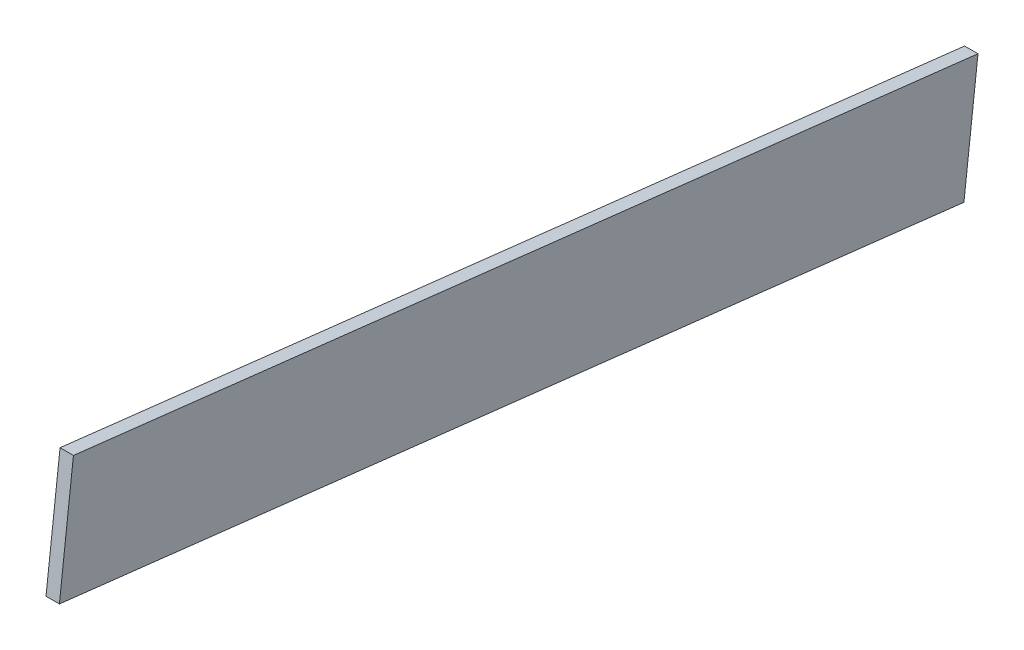
ISO-10303-21;
HEADER;
FILE_DESCRIPTION(('STEP AP214'),'2;1');
FILE_NAME('part.step','',(''),(''),'','','');
FILE_SCHEMA(('AUTOMOTIVE_DESIGN { 1 0 10303 214 1 1 1 1 }'));
ENDSEC;
DATA;
#1=APPLICATION_CONTEXT('core data for automotive mechanical design processes');
#2=APPLICATION_PROTOCOL_DEFINITION('international standard','automotive_design',2000,#1);
#3=PRODUCT_CONTEXT('',#1,'mechanical');
#4=PRODUCT('Part','Part','',(#3));
#5=PRODUCT_RELATED_PRODUCT_CATEGORY('part','',(#4));
#6=PRODUCT_DEFINITION_FORMATION('','',#4);
#7=PRODUCT_DEFINITION_CONTEXT('part definition',#1,'design');
#8=PRODUCT_DEFINITION('design','',#6,#7);
#9=PRODUCT_DEFINITION_SHAPE('','',#8);
#10=(LENGTH_UNIT() NAMED_UNIT(*) SI_UNIT(.MILLI.,.METRE.));
#11=(NAMED_UNIT(*) PLANE_ANGLE_UNIT() SI_UNIT($,.RADIAN.));
#12=(NAMED_UNIT(*) SI_UNIT($,.STERADIAN.) SOLID_ANGLE_UNIT());
#13=UNCERTAINTY_MEASURE_WITH_UNIT(LENGTH_MEASURE(1.E-05),#10,'distance_accuracy_value','');
#14=(GEOMETRIC_REPRESENTATION_CONTEXT(3) GLOBAL_UNCERTAINTY_ASSIGNED_CONTEXT((#13)) GLOBAL_UNIT_ASSIGNED_CONTEXT((#10,
#11,#12)) REPRESENTATION_CONTEXT('',''));
#15=CARTESIAN_POINT('',(0.,0.,0.));
#16=DIRECTION('',(0.,0.,1.));
#17=DIRECTION('',(1.,0.,0.));
#18=AXIS2_PLACEMENT_3D('',#15,#16,#17);
#19=CARTESIAN_POINT('',(-225.499999999979,382.317741216165,-124.90478099328));
#20=DIRECTION('',(0.,-0.993404762241953,0.114660273656609));
#21=DIRECTION('',(0.,-0.114660273656609,-0.993404762241953));
#22=AXIS2_PLACEMENT_3D('',#19,#20,#21);
#23=PLANE('',#22);
#24=DIRECTION('',(0.,-0.114660273656609,-0.993404762241953));
#25=VECTOR('',#24,1.);
#26=CARTESIAN_POINT('',(-222.999999999979,382.317741216165,-124.90478099328));
#27=LINE('',#26,#25);
#28=CARTESIAN_POINT('',(-222.999999999979,382.317741216165,-124.90478099328));
#29=VERTEX_POINT('',#28);
#30=CARTESIAN_POINT('',(-222.999999999979,362.825494694542,-293.783590574412));
#31=VERTEX_POINT('',#30);
#32=EDGE_CURVE('E100',#29,#31,#27,.T.);
#33=ORIENTED_EDGE('',*,*,#32,.T.);
#34=DIRECTION('',(1.,0.,0.));
#35=VECTOR('',#34,1.);
#36=CARTESIAN_POINT('',(-225.499999999979,362.825494694542,-293.783590574412));
#37=LINE('',#36,#35);
#38=CARTESIAN_POINT('',(-225.499999999979,362.825494694542,-293.783590574412));
#39=VERTEX_POINT('',#38);
#40=EDGE_CURVE('E11',#39,#31,#37,.T.);
#41=ORIENTED_EDGE('',*,*,#40,.F.);
#42=DIRECTION('',(0.,-0.114660273656609,-0.993404762241953));
#43=VECTOR('',#42,1.);
#44=CARTESIAN_POINT('',(-225.499999999979,382.317741216165,-124.90478099328));
#45=LINE('',#44,#43);
#46=CARTESIAN_POINT('',(-225.499999999979,382.317741216165,-124.90478099328));
#47=VERTEX_POINT('',#46);
#48=EDGE_CURVE('E88',#47,#39,#45,.T.);
#49=ORIENTED_EDGE('',*,*,#48,.F.);
#50=DIRECTION('',(1.,0.,0.));
#51=VECTOR('',#50,1.);
#52=CARTESIAN_POINT('',(-225.499999999979,382.317741216165,-124.90478099328));
#53=LINE('',#52,#51);
#54=EDGE_CURVE('E96',#47,#29,#53,.T.);
#55=ORIENTED_EDGE('',*,*,#54,.T.);
#56=EDGE_LOOP('',(#33,#41,#49,#55));
#57=FACE_BOUND('',#56,.T.);
#58=ADVANCED_FACE('F37',(#57),#23,.F.);
#59=CARTESIAN_POINT('',(-225.499999999979,362.825494694542,-293.783590574412));
#60=DIRECTION('',(0.,0.114660273656612,0.993404762241953));
#61=DIRECTION('',(0.,-0.993404762241953,0.114660273656612));
#62=AXIS2_PLACEMENT_3D('',#59,#60,#61);
#63=PLANE('',#62);
#64=DIRECTION('',(0.,-0.993404762241953,0.114660273656612));
#65=VECTOR('',#64,1.);
#66=CARTESIAN_POINT('',(-222.999999999979,362.825494694542,-293.783590574412));
#67=LINE('',#66,#65);
#68=CARTESIAN_POINT('',(-222.999999999979,340.120839065992,-291.162985030129));
#69=VERTEX_POINT('',#68);
#70=EDGE_CURVE('E92',#31,#69,#67,.T.);
#71=ORIENTED_EDGE('',*,*,#70,.T.);
#72=DIRECTION('',(1.,0.,0.));
#73=VECTOR('',#72,1.);
#74=CARTESIAN_POINT('',(-225.499999999979,340.120839065992,-291.162985030129));
#75=LINE('',#74,#73);
#76=CARTESIAN_POINT('',(-225.499999999979,340.120839065992,-291.162985030129));
#77=VERTEX_POINT('',#76);
#78=EDGE_CURVE('E45',#77,#69,#75,.T.);
#79=ORIENTED_EDGE('',*,*,#78,.F.);
#80=DIRECTION('',(0.,-0.993404762241953,0.114660273656612));
#81=VECTOR('',#80,1.);
#82=CARTESIAN_POINT('',(-225.499999999979,362.825494694542,-293.783590574412));
#83=LINE('',#82,#81);
#84=EDGE_CURVE('E83',#39,#77,#83,.T.);
#85=ORIENTED_EDGE('',*,*,#84,.F.);
#86=ORIENTED_EDGE('',*,*,#40,.T.);
#87=EDGE_LOOP('',(#71,#79,#85,#86));
#88=FACE_BOUND('',#87,.T.);
#89=ADVANCED_FACE('F91',(#88),#63,.F.);
#90=CARTESIAN_POINT('',(-225.499999999979,340.120839065992,-291.162985030129));
#91=DIRECTION('',(0.,0.993404762241953,-0.114660273656609));
#92=DIRECTION('',(0.,0.114660273656609,0.993404762241953));
#93=AXIS2_PLACEMENT_3D('',#90,#91,#92);
#94=PLANE('',#93);
#95=DIRECTION('',(0.,0.114660273656609,0.993404762241953));
#96=VECTOR('',#95,1.);
#97=CARTESIAN_POINT('',(-222.999999999979,340.120839065992,-291.162985030129));
#98=LINE('',#97,#96);
#99=CARTESIAN_POINT('',(-222.999999999979,359.613085587616,-122.284175448997));
#100=VERTEX_POINT('',#99);
#101=EDGE_CURVE('E70',#69,#100,#98,.T.);
#102=ORIENTED_EDGE('',*,*,#101,.T.);
#103=DIRECTION('',(1.,0.,0.));
#104=VECTOR('',#103,1.);
#105=CARTESIAN_POINT('',(-225.499999999979,359.613085587616,-122.284175448997));
#106=LINE('',#105,#104);
#107=CARTESIAN_POINT('',(-225.499999999979,359.613085587616,-122.284175448997));
#108=VERTEX_POINT('',#107);
#109=EDGE_CURVE('E93',#108,#100,#106,.T.);
#110=ORIENTED_EDGE('',*,*,#109,.F.);
#111=DIRECTION('',(0.,0.114660273656609,0.993404762241953));
#112=VECTOR('',#111,1.);
#113=CARTESIAN_POINT('',(-225.499999999979,340.120839065992,-291.162985030129));
#114=LINE('',#113,#112);
#115=EDGE_CURVE('E86',#77,#108,#114,.T.);
#116=ORIENTED_EDGE('',*,*,#115,.F.);
#117=ORIENTED_EDGE('',*,*,#78,.T.);
#118=EDGE_LOOP('',(#102,#110,#116,#117));
#119=FACE_BOUND('',#118,.T.);
#120=ADVANCED_FACE('F94',(#119),#94,.F.);
#121=CARTESIAN_POINT('',(-225.499999999979,359.613085587616,-122.284175448997));
#122=DIRECTION('',(0.,-0.114660273656609,-0.993404762241953));
#123=DIRECTION('',(0.,0.993404762241953,-0.114660273656609));
#124=AXIS2_PLACEMENT_3D('',#121,#122,#123);
#125=PLANE('',#124);
#126=DIRECTION('',(0.,0.993404762241953,-0.114660273656609));
#127=VECTOR('',#126,1.);
#128=CARTESIAN_POINT('',(-222.999999999979,359.613085587616,-122.284175448997));
#129=LINE('',#128,#127);
#130=EDGE_CURVE('E76',#100,#29,#129,.T.);
#131=ORIENTED_EDGE('',*,*,#130,.T.);
#132=ORIENTED_EDGE('',*,*,#54,.F.);
#133=DIRECTION('',(0.,0.993404762241953,-0.114660273656609));
#134=VECTOR('',#133,1.);
#135=CARTESIAN_POINT('',(-225.499999999979,359.613085587616,-122.284175448997));
#136=LINE('',#135,#134);
#137=EDGE_CURVE('E53',#108,#47,#136,.T.);
#138=ORIENTED_EDGE('',*,*,#137,.F.);
#139=ORIENTED_EDGE('',*,*,#109,.T.);
#140=EDGE_LOOP('',(#131,#132,#138,#139));
#141=FACE_BOUND('',#140,.T.);
#142=ADVANCED_FACE('F107',(#141),#125,.F.);
#143=CARTESIAN_POINT('',(-225.499999999977,-1.36004311383917E-12,1.56978224329876E-13));
#144=DIRECTION('',(-1.,0.,0.));
#145=DIRECTION('',(0.,-1.,0.));
#146=AXIS2_PLACEMENT_3D('',#143,#144,#145);
#147=PLANE('',#146);
#148=ORIENTED_EDGE('',*,*,#48,.T.);
#149=ORIENTED_EDGE('',*,*,#84,.T.);
#150=ORIENTED_EDGE('',*,*,#115,.T.);
#151=ORIENTED_EDGE('',*,*,#137,.T.);
#152=EDGE_LOOP('',(#148,#149,#150,#151));
#153=FACE_BOUND('',#152,.T.);
#154=ADVANCED_FACE('F84',(#153),#147,.T.);
#155=CARTESIAN_POINT('',(-222.999999999977,-1.34512505429539E-12,1.55256359431771E-13));
#156=DIRECTION('',(-1.,0.,0.));
#157=DIRECTION('',(0.,-1.,0.));
#158=AXIS2_PLACEMENT_3D('',#155,#156,#157);
#159=PLANE('',#158);
#160=ORIENTED_EDGE('',*,*,#32,.F.);
#161=ORIENTED_EDGE('',*,*,#130,.F.);
#162=ORIENTED_EDGE('',*,*,#101,.F.);
#163=ORIENTED_EDGE('',*,*,#70,.F.);
#164=EDGE_LOOP('',(#160,#161,#162,#163));
#165=FACE_BOUND('',#164,.T.);
#166=ADVANCED_FACE('F110',(#165),#159,.F.);
#167=CLOSED_SHELL('',(#58,#89,#120,#142,#154,#166));
#168=MANIFOLD_SOLID_BREP('B2',#167);
#169=ADVANCED_BREP_SHAPE_REPRESENTATION('',(#18,#168),#14);
#170=SHAPE_DEFINITION_REPRESENTATION(#9,#169);
ENDSEC;
END-ISO-10303-21;
